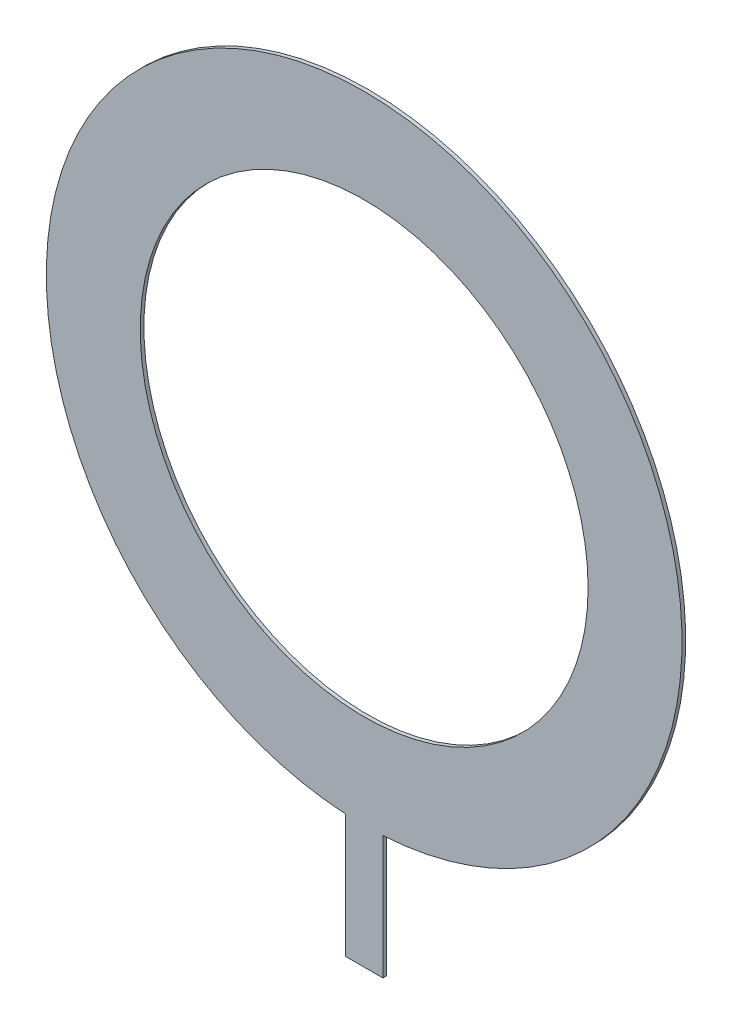
ISO-10303-21;
HEADER;
FILE_DESCRIPTION(('STEP AP214'),'2;1');
FILE_NAME('part.step','',(''),(''),'','','');
FILE_SCHEMA(('AUTOMOTIVE_DESIGN { 1 0 10303 214 1 1 1 1 }'));
ENDSEC;
DATA;
#1=APPLICATION_CONTEXT('core data for automotive mechanical design processes');
#2=APPLICATION_PROTOCOL_DEFINITION('international standard','automotive_design',2000,#1);
#3=PRODUCT_CONTEXT('',#1,'mechanical');
#4=PRODUCT('Part','Part','',(#3));
#5=PRODUCT_RELATED_PRODUCT_CATEGORY('part','',(#4));
#6=PRODUCT_DEFINITION_FORMATION('','',#4);
#7=PRODUCT_DEFINITION_CONTEXT('part definition',#1,'design');
#8=PRODUCT_DEFINITION('design','',#6,#7);
#9=PRODUCT_DEFINITION_SHAPE('','',#8);
#10=(LENGTH_UNIT() NAMED_UNIT(*) SI_UNIT(.MILLI.,.METRE.));
#11=(NAMED_UNIT(*) PLANE_ANGLE_UNIT() SI_UNIT($,.RADIAN.));
#12=(NAMED_UNIT(*) SI_UNIT($,.STERADIAN.) SOLID_ANGLE_UNIT());
#13=UNCERTAINTY_MEASURE_WITH_UNIT(LENGTH_MEASURE(1.E-05),#10,'distance_accuracy_value','');
#14=(GEOMETRIC_REPRESENTATION_CONTEXT(3) GLOBAL_UNCERTAINTY_ASSIGNED_CONTEXT((#13)) GLOBAL_UNIT_ASSIGNED_CONTEXT((#10,
#11,#12)) REPRESENTATION_CONTEXT('',''));
#15=CARTESIAN_POINT('',(0.,0.,0.));
#16=DIRECTION('',(0.,0.,1.));
#17=DIRECTION('',(1.,0.,0.));
#18=AXIS2_PLACEMENT_3D('',#15,#16,#17);
#19=CARTESIAN_POINT('',(0.,-15.25,0.127));
#20=DIRECTION('',(0.,1.,0.));
#21=DIRECTION('',(0.,0.,1.));
#22=AXIS2_PLACEMENT_3D('',#19,#20,#21);
#23=PLANE('',#22);
#24=DIRECTION('',(1.,0.,0.));
#25=VECTOR('',#24,1.);
#26=CARTESIAN_POINT('',(0.,-15.25,0.));
#27=LINE('',#26,#25);
#28=CARTESIAN_POINT('',(-0.65,-15.25,0.));
#29=VERTEX_POINT('',#28);
#30=CARTESIAN_POINT('',(0.65,-15.25,0.));
#31=VERTEX_POINT('',#30);
#32=EDGE_CURVE('E101',#29,#31,#27,.T.);
#33=ORIENTED_EDGE('',*,*,#32,.T.);
#34=DIRECTION('',(0.,0.,-1.));
#35=VECTOR('',#34,1.);
#36=CARTESIAN_POINT('',(0.65,-15.25,0.127));
#37=LINE('',#36,#35);
#38=CARTESIAN_POINT('',(0.65,-15.25,0.127));
#39=VERTEX_POINT('',#38);
#40=EDGE_CURVE('E11',#39,#31,#37,.T.);
#41=ORIENTED_EDGE('',*,*,#40,.F.);
#42=DIRECTION('',(1.,0.,0.));
#43=VECTOR('',#42,1.);
#44=CARTESIAN_POINT('',(0.,-15.25,0.127));
#45=LINE('',#44,#43);
#46=CARTESIAN_POINT('',(-0.65,-15.25,0.127));
#47=VERTEX_POINT('',#46);
#48=EDGE_CURVE('E84',#47,#39,#45,.T.);
#49=ORIENTED_EDGE('',*,*,#48,.F.);
#50=DIRECTION('',(0.,0.,-1.));
#51=VECTOR('',#50,1.);
#52=CARTESIAN_POINT('',(-0.65,-15.25,0.127));
#53=LINE('',#52,#51);
#54=EDGE_CURVE('E50',#47,#29,#53,.T.);
#55=ORIENTED_EDGE('',*,*,#54,.T.);
#56=EDGE_LOOP('',(#33,#41,#49,#55));
#57=FACE_BOUND('',#56,.T.);
#58=ADVANCED_FACE('F34',(#57),#23,.F.);
#59=CARTESIAN_POINT('',(0.650000000000002,0.,0.127));
#60=DIRECTION('',(-1.,0.,0.));
#61=DIRECTION('',(0.,-1.,0.));
#62=AXIS2_PLACEMENT_3D('',#59,#60,#61);
#63=PLANE('',#62);
#64=DIRECTION('',(0.,1.,0.));
#65=VECTOR('',#64,1.);
#66=CARTESIAN_POINT('',(0.650000000000002,0.,0.));
#67=LINE('',#66,#65);
#68=CARTESIAN_POINT('',(0.65,-10.9807786609147,0.));
#69=VERTEX_POINT('',#68);
#70=EDGE_CURVE('E89',#31,#69,#67,.T.);
#71=ORIENTED_EDGE('',*,*,#70,.T.);
#72=DIRECTION('',(0.,0.,-1.));
#73=VECTOR('',#72,1.);
#74=CARTESIAN_POINT('',(0.65,-10.9807786609147,0.127));
#75=LINE('',#74,#73);
#76=CARTESIAN_POINT('',(0.65,-10.9807786609147,0.127));
#77=VERTEX_POINT('',#76);
#78=EDGE_CURVE('E42',#77,#69,#75,.T.);
#79=ORIENTED_EDGE('',*,*,#78,.F.);
#80=DIRECTION('',(0.,1.,0.));
#81=VECTOR('',#80,1.);
#82=CARTESIAN_POINT('',(0.650000000000002,0.,0.127));
#83=LINE('',#82,#81);
#84=EDGE_CURVE('E76',#39,#77,#83,.T.);
#85=ORIENTED_EDGE('',*,*,#84,.F.);
#86=ORIENTED_EDGE('',*,*,#40,.T.);
#87=EDGE_LOOP('',(#71,#79,#85,#86));
#88=FACE_BOUND('',#87,.T.);
#89=ADVANCED_FACE('F88',(#88),#63,.F.);
#90=CARTESIAN_POINT('',(0.,0.,0.127));
#91=DIRECTION('',(0.,0.,-1.));
#92=DIRECTION('',(-1.,0.,0.));
#93=AXIS2_PLACEMENT_3D('',#90,#91,#92);
#94=CYLINDRICAL_SURFACE('',#93,11.);
#95=CARTESIAN_POINT('',(0.,0.,0.));
#96=DIRECTION('',(0.,0.,1.));
#97=DIRECTION('',(1.,0.,0.));
#98=AXIS2_PLACEMENT_3D('',#95,#96,#97);
#99=CIRCLE('',#98,11.);
#100=CARTESIAN_POINT('',(-0.65,-10.9807786609147,0.));
#101=VERTEX_POINT('',#100);
#102=EDGE_CURVE('E104',#69,#101,#99,.T.);
#103=ORIENTED_EDGE('',*,*,#102,.T.);
#104=DIRECTION('',(0.,0.,-1.));
#105=VECTOR('',#104,1.);
#106=CARTESIAN_POINT('',(-0.65,-10.9807786609147,0.127));
#107=LINE('',#106,#105);
#108=CARTESIAN_POINT('',(-0.65,-10.9807786609147,0.127));
#109=VERTEX_POINT('',#108);
#110=EDGE_CURVE('E65',#109,#101,#107,.T.);
#111=ORIENTED_EDGE('',*,*,#110,.F.);
#112=CARTESIAN_POINT('',(0.,0.,0.127));
#113=DIRECTION('',(0.,0.,1.));
#114=DIRECTION('',(1.,0.,0.));
#115=AXIS2_PLACEMENT_3D('',#112,#113,#114);
#116=CIRCLE('',#115,11.);
#117=EDGE_CURVE('E83',#77,#109,#116,.T.);
#118=ORIENTED_EDGE('',*,*,#117,.F.);
#119=ORIENTED_EDGE('',*,*,#78,.T.);
#120=EDGE_LOOP('',(#103,#111,#118,#119));
#121=FACE_BOUND('',#120,.T.);
#122=ADVANCED_FACE('F92',(#121),#94,.T.);
#123=CARTESIAN_POINT('',(-0.65,0.,0.127));
#124=DIRECTION('',(-1.,0.,0.));
#125=DIRECTION('',(0.,-1.,0.));
#126=AXIS2_PLACEMENT_3D('',#123,#124,#125);
#127=PLANE('',#126);
#128=DIRECTION('',(0.,1.,0.));
#129=VECTOR('',#128,1.);
#130=CARTESIAN_POINT('',(-0.65,0.,0.));
#131=LINE('',#130,#129);
#132=EDGE_CURVE('E106',#29,#101,#131,.T.);
#133=ORIENTED_EDGE('',*,*,#132,.F.);
#134=ORIENTED_EDGE('',*,*,#54,.F.);
#135=DIRECTION('',(0.,1.,0.));
#136=VECTOR('',#135,1.);
#137=CARTESIAN_POINT('',(-0.65,0.,0.127));
#138=LINE('',#137,#136);
#139=EDGE_CURVE('E93',#47,#109,#138,.T.);
#140=ORIENTED_EDGE('',*,*,#139,.T.);
#141=ORIENTED_EDGE('',*,*,#110,.T.);
#142=EDGE_LOOP('',(#133,#134,#140,#141));
#143=FACE_BOUND('',#142,.T.);
#144=ADVANCED_FACE('F119',(#143),#127,.T.);
#145=CARTESIAN_POINT('',(0.,0.,0.127));
#146=DIRECTION('',(0.,0.,-1.));
#147=DIRECTION('',(-1.,0.,0.));
#148=AXIS2_PLACEMENT_3D('',#145,#146,#147);
#149=CYLINDRICAL_SURFACE('',#148,7.75);
#150=CARTESIAN_POINT('',(0.,0.,0.127));
#151=DIRECTION('',(0.,0.,1.));
#152=DIRECTION('',(1.,0.,0.));
#153=AXIS2_PLACEMENT_3D('',#150,#151,#152);
#154=CIRCLE('',#153,7.75);
#155=CARTESIAN_POINT('',(7.75,0.,0.127));
#156=VERTEX_POINT('',#155);
#157=EDGE_CURVE('E95',#156,#156,#154,.T.);
#158=ORIENTED_EDGE('',*,*,#157,.T.);
#159=EDGE_LOOP('',(#158));
#160=FACE_BOUND('',#159,.T.);
#161=CARTESIAN_POINT('',(0.,0.,0.));
#162=DIRECTION('',(0.,0.,1.));
#163=DIRECTION('',(1.,0.,0.));
#164=AXIS2_PLACEMENT_3D('',#161,#162,#163);
#165=CIRCLE('',#164,7.75);
#166=CARTESIAN_POINT('',(7.75,0.,0.));
#167=VERTEX_POINT('',#166);
#168=EDGE_CURVE('E109',#167,#167,#165,.T.);
#169=ORIENTED_EDGE('',*,*,#168,.F.);
#170=EDGE_LOOP('',(#169));
#171=FACE_BOUND('',#170,.T.);
#172=ADVANCED_FACE('F117',(#160,#171),#149,.F.);
#173=CARTESIAN_POINT('',(0.,0.,0.127));
#174=DIRECTION('',(0.,0.,1.));
#175=DIRECTION('',(1.,0.,0.));
#176=AXIS2_PLACEMENT_3D('',#173,#174,#175);
#177=PLANE('',#176);
#178=ORIENTED_EDGE('',*,*,#48,.T.);
#179=ORIENTED_EDGE('',*,*,#84,.T.);
#180=ORIENTED_EDGE('',*,*,#117,.T.);
#181=ORIENTED_EDGE('',*,*,#139,.F.);
#182=EDGE_LOOP('',(#178,#179,#180,#181));
#183=FACE_BOUND('',#182,.T.);
#184=ORIENTED_EDGE('',*,*,#157,.F.);
#185=EDGE_LOOP('',(#184));
#186=FACE_BOUND('',#185,.T.);
#187=ADVANCED_FACE('F79',(#183,#186),#177,.T.);
#188=CARTESIAN_POINT('',(0.,0.,0.));
#189=DIRECTION('',(0.,0.,1.));
#190=DIRECTION('',(1.,0.,0.));
#191=AXIS2_PLACEMENT_3D('',#188,#189,#190);
#192=PLANE('',#191);
#193=ORIENTED_EDGE('',*,*,#32,.F.);
#194=ORIENTED_EDGE('',*,*,#132,.T.);
#195=ORIENTED_EDGE('',*,*,#102,.F.);
#196=ORIENTED_EDGE('',*,*,#70,.F.);
#197=EDGE_LOOP('',(#193,#194,#195,#196));
#198=FACE_BOUND('',#197,.T.);
#199=ORIENTED_EDGE('',*,*,#168,.T.);
#200=EDGE_LOOP('',(#199));
#201=FACE_BOUND('',#200,.T.);
#202=ADVANCED_FACE('F115',(#198,#201),#192,.F.);
#203=CLOSED_SHELL('',(#58,#89,#122,#144,#172,#187,#202));
#204=MANIFOLD_SOLID_BREP('B2',#203);
#205=ADVANCED_BREP_SHAPE_REPRESENTATION('',(#18,#204),#14);
#206=SHAPE_DEFINITION_REPRESENTATION(#9,#205);
ENDSEC;
END-ISO-10303-21;
